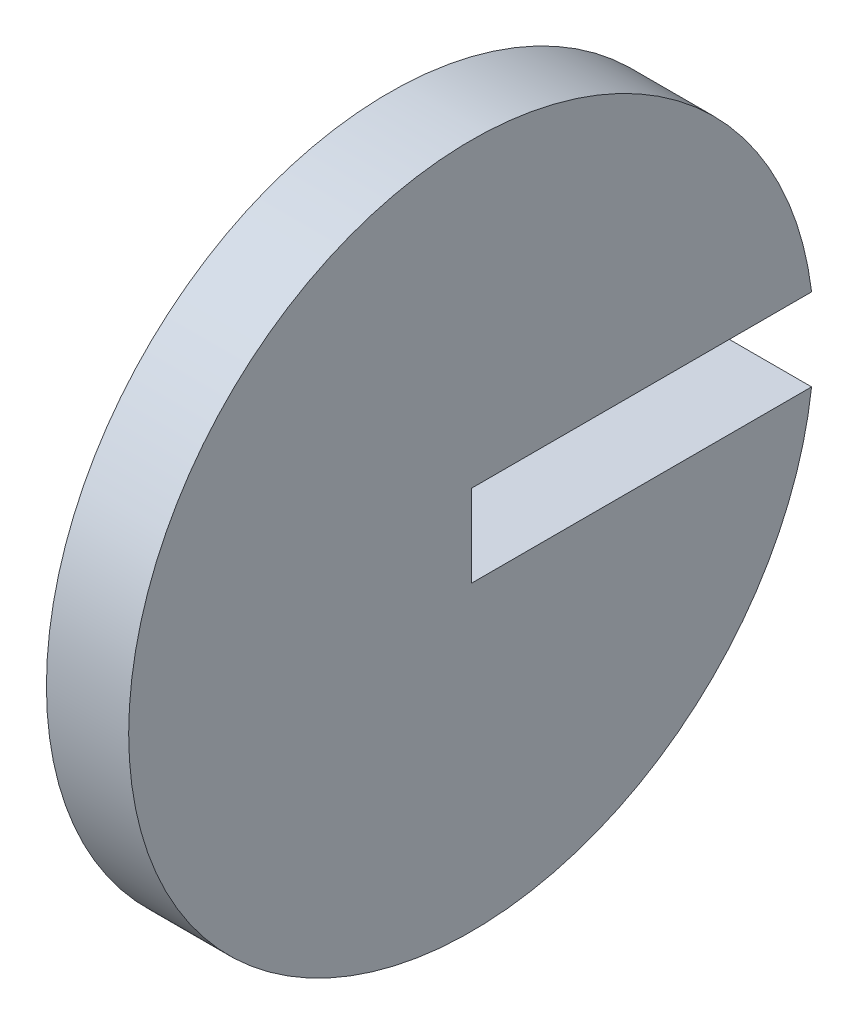
ISO-10303-21;
HEADER;
FILE_DESCRIPTION(('STEP AP214'),'2;1');
FILE_NAME('part.step','',(''),(''),'','','');
FILE_SCHEMA(('AUTOMOTIVE_DESIGN { 1 0 10303 214 1 1 1 1 }'));
ENDSEC;
DATA;
#1=APPLICATION_CONTEXT('core data for automotive mechanical design processes');
#2=APPLICATION_PROTOCOL_DEFINITION('international standard','automotive_design',2000,#1);
#3=PRODUCT_CONTEXT('',#1,'mechanical');
#4=PRODUCT('Part','Part','',(#3));
#5=PRODUCT_RELATED_PRODUCT_CATEGORY('part','',(#4));
#6=PRODUCT_DEFINITION_FORMATION('','',#4);
#7=PRODUCT_DEFINITION_CONTEXT('part definition',#1,'design');
#8=PRODUCT_DEFINITION('design','',#6,#7);
#9=PRODUCT_DEFINITION_SHAPE('','',#8);
#10=(LENGTH_UNIT() NAMED_UNIT(*) SI_UNIT(.MILLI.,.METRE.));
#11=(NAMED_UNIT(*) PLANE_ANGLE_UNIT() SI_UNIT($,.RADIAN.));
#12=(NAMED_UNIT(*) SI_UNIT($,.STERADIAN.) SOLID_ANGLE_UNIT());
#13=UNCERTAINTY_MEASURE_WITH_UNIT(LENGTH_MEASURE(1.E-05),#10,'distance_accuracy_value','');
#14=(GEOMETRIC_REPRESENTATION_CONTEXT(3) GLOBAL_UNCERTAINTY_ASSIGNED_CONTEXT((#13)) GLOBAL_UNIT_ASSIGNED_CONTEXT((#10,
#11,#12)) REPRESENTATION_CONTEXT('',''));
#15=CARTESIAN_POINT('',(0.,0.,0.));
#16=DIRECTION('',(0.,0.,1.));
#17=DIRECTION('',(1.,0.,0.));
#18=AXIS2_PLACEMENT_3D('',#15,#16,#17);
#19=CARTESIAN_POINT('',(3.,0.,0.));
#20=DIRECTION('',(-1.,0.,0.));
#21=DIRECTION('',(0.,0.,1.));
#22=AXIS2_PLACEMENT_3D('',#19,#20,#21);
#23=CYLINDRICAL_SURFACE('',#22,12.5);
#24=CARTESIAN_POINT('',(0.,0.,0.));
#25=DIRECTION('',(1.,0.,0.));
#26=DIRECTION('',(0.,0.,-1.));
#27=AXIS2_PLACEMENT_3D('',#24,#25,#26);
#28=CIRCLE('',#27,12.5);
#29=CARTESIAN_POINT('',(0.,1.5,-12.4096736459909));
#30=VERTEX_POINT('',#29);
#31=CARTESIAN_POINT('',(0.,-1.5,-12.4096736459909));
#32=VERTEX_POINT('',#31);
#33=EDGE_CURVE('E99',#30,#32,#28,.T.);
#34=ORIENTED_EDGE('',*,*,#33,.T.);
#35=DIRECTION('',(-1.,0.,0.));
#36=VECTOR('',#35,1.);
#37=CARTESIAN_POINT('',(3.,-1.5,-12.4096736459909));
#38=LINE('',#37,#36);
#39=CARTESIAN_POINT('',(3.,-1.5,-12.4096736459909));
#40=VERTEX_POINT('',#39);
#41=EDGE_CURVE('E55',#32,#40,#38,.F.);
#42=ORIENTED_EDGE('',*,*,#41,.T.);
#43=CARTESIAN_POINT('',(3.,0.,0.));
#44=DIRECTION('',(1.,0.,0.));
#45=DIRECTION('',(0.,0.,-1.));
#46=AXIS2_PLACEMENT_3D('',#43,#44,#45);
#47=CIRCLE('',#46,12.5);
#48=CARTESIAN_POINT('',(3.,1.5,-12.4096736459909));
#49=VERTEX_POINT('',#48);
#50=EDGE_CURVE('E40',#49,#40,#47,.T.);
#51=ORIENTED_EDGE('',*,*,#50,.F.);
#52=DIRECTION('',(-1.,0.,0.));
#53=VECTOR('',#52,1.);
#54=CARTESIAN_POINT('',(3.,1.5,-12.4096736459909));
#55=LINE('',#54,#53);
#56=EDGE_CURVE('E78',#49,#30,#55,.T.);
#57=ORIENTED_EDGE('',*,*,#56,.T.);
#58=EDGE_LOOP('',(#34,#42,#51,#57));
#59=FACE_BOUND('',#58,.T.);
#60=ADVANCED_FACE('F33',(#59),#23,.T.);
#61=CARTESIAN_POINT('',(3.,0.,0.));
#62=DIRECTION('',(1.,0.,0.));
#63=DIRECTION('',(0.,0.,-1.));
#64=AXIS2_PLACEMENT_3D('',#61,#62,#63);
#65=PLANE('',#64);
#66=DIRECTION('',(0.,0.,-1.));
#67=VECTOR('',#66,1.);
#68=CARTESIAN_POINT('',(3.,-1.5,0.));
#69=LINE('',#68,#67);
#70=CARTESIAN_POINT('',(3.,-1.5,0.));
#71=VERTEX_POINT('',#70);
#72=EDGE_CURVE('E88',#71,#40,#69,.T.);
#73=ORIENTED_EDGE('',*,*,#72,.F.);
#74=DIRECTION('',(0.,-1.,0.));
#75=VECTOR('',#74,1.);
#76=CARTESIAN_POINT('',(3.,-1.5,0.));
#77=LINE('',#76,#75);
#78=CARTESIAN_POINT('',(3.,1.5,0.));
#79=VERTEX_POINT('',#78);
#80=EDGE_CURVE('E76',#79,#71,#77,.T.);
#81=ORIENTED_EDGE('',*,*,#80,.F.);
#82=DIRECTION('',(0.,0.,1.));
#83=VECTOR('',#82,1.);
#84=CARTESIAN_POINT('',(3.,1.5,0.));
#85=LINE('',#84,#83);
#86=EDGE_CURVE('E92',#49,#79,#85,.T.);
#87=ORIENTED_EDGE('',*,*,#86,.F.);
#88=ORIENTED_EDGE('',*,*,#50,.T.);
#89=EDGE_LOOP('',(#73,#81,#87,#88));
#90=FACE_BOUND('',#89,.T.);
#91=ADVANCED_FACE('F107',(#90),#65,.T.);
#92=CARTESIAN_POINT('',(0.,0.,0.));
#93=DIRECTION('',(1.,0.,0.));
#94=DIRECTION('',(0.,0.,-1.));
#95=AXIS2_PLACEMENT_3D('',#92,#93,#94);
#96=PLANE('',#95);
#97=DIRECTION('',(0.,-1.,0.));
#98=VECTOR('',#97,1.);
#99=CARTESIAN_POINT('',(0.,-1.5,0.));
#100=LINE('',#99,#98);
#101=CARTESIAN_POINT('',(0.,1.5,0.));
#102=VERTEX_POINT('',#101);
#103=CARTESIAN_POINT('',(0.,-1.5,0.));
#104=VERTEX_POINT('',#103);
#105=EDGE_CURVE('E47',#102,#104,#100,.T.);
#106=ORIENTED_EDGE('',*,*,#105,.T.);
#107=DIRECTION('',(0.,0.,-1.));
#108=VECTOR('',#107,1.);
#109=CARTESIAN_POINT('',(0.,-1.5,0.));
#110=LINE('',#109,#108);
#111=EDGE_CURVE('E81',#104,#32,#110,.T.);
#112=ORIENTED_EDGE('',*,*,#111,.T.);
#113=ORIENTED_EDGE('',*,*,#33,.F.);
#114=DIRECTION('',(0.,0.,1.));
#115=VECTOR('',#114,1.);
#116=CARTESIAN_POINT('',(0.,1.5,0.));
#117=LINE('',#116,#115);
#118=EDGE_CURVE('E11',#30,#102,#117,.T.);
#119=ORIENTED_EDGE('',*,*,#118,.T.);
#120=EDGE_LOOP('',(#106,#112,#113,#119));
#121=FACE_BOUND('',#120,.T.);
#122=ADVANCED_FACE('F87',(#121),#96,.F.);
#123=CARTESIAN_POINT('',(0.,-1.5,0.));
#124=DIRECTION('',(0.,-1.,0.));
#125=DIRECTION('',(0.,0.,-1.));
#126=AXIS2_PLACEMENT_3D('',#123,#124,#125);
#127=PLANE('',#126);
#128=ORIENTED_EDGE('',*,*,#111,.F.);
#129=DIRECTION('',(1.,0.,0.));
#130=VECTOR('',#129,1.);
#131=CARTESIAN_POINT('',(0.,-1.5,0.));
#132=LINE('',#131,#130);
#133=EDGE_CURVE('E73',#104,#71,#132,.T.);
#134=ORIENTED_EDGE('',*,*,#133,.T.);
#135=ORIENTED_EDGE('',*,*,#72,.T.);
#136=ORIENTED_EDGE('',*,*,#41,.F.);
#137=EDGE_LOOP('',(#128,#134,#135,#136));
#138=FACE_BOUND('',#137,.T.);
#139=ADVANCED_FACE('F82',(#138),#127,.F.);
#140=CARTESIAN_POINT('',(0.,1.5,0.));
#141=DIRECTION('',(0.,1.,0.));
#142=DIRECTION('',(0.,0.,1.));
#143=AXIS2_PLACEMENT_3D('',#140,#141,#142);
#144=PLANE('',#143);
#145=ORIENTED_EDGE('',*,*,#86,.T.);
#146=DIRECTION('',(1.,0.,0.));
#147=VECTOR('',#146,1.);
#148=CARTESIAN_POINT('',(0.,1.5,0.));
#149=LINE('',#148,#147);
#150=EDGE_CURVE('E79',#102,#79,#149,.T.);
#151=ORIENTED_EDGE('',*,*,#150,.F.);
#152=ORIENTED_EDGE('',*,*,#118,.F.);
#153=ORIENTED_EDGE('',*,*,#56,.F.);
#154=EDGE_LOOP('',(#145,#151,#152,#153));
#155=FACE_BOUND('',#154,.T.);
#156=ADVANCED_FACE('F105',(#155),#144,.F.);
#157=CARTESIAN_POINT('',(0.,-1.5,0.));
#158=DIRECTION('',(0.,0.,1.));
#159=DIRECTION('',(1.,0.,0.));
#160=AXIS2_PLACEMENT_3D('',#157,#158,#159);
#161=PLANE('',#160);
#162=ORIENTED_EDGE('',*,*,#80,.T.);
#163=ORIENTED_EDGE('',*,*,#133,.F.);
#164=ORIENTED_EDGE('',*,*,#105,.F.);
#165=ORIENTED_EDGE('',*,*,#150,.T.);
#166=EDGE_LOOP('',(#162,#163,#164,#165));
#167=FACE_BOUND('',#166,.T.);
#168=ADVANCED_FACE('F74',(#167),#161,.F.);
#169=CLOSED_SHELL('',(#60,#91,#122,#139,#156,#168));
#170=MANIFOLD_SOLID_BREP('B2',#169);
#171=ADVANCED_BREP_SHAPE_REPRESENTATION('',(#18,#170),#14);
#172=SHAPE_DEFINITION_REPRESENTATION(#9,#171);
ENDSEC;
END-ISO-10303-21;
